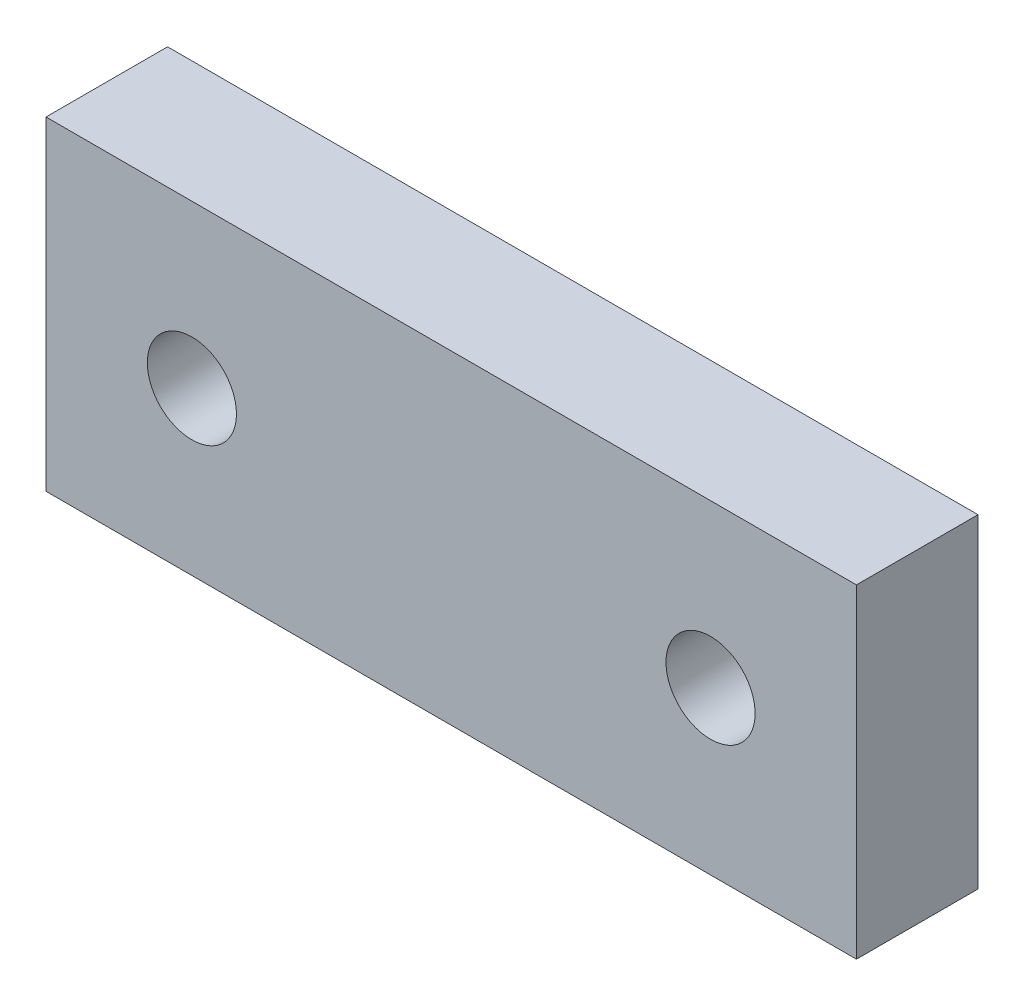
ISO-10303-21;
HEADER;
FILE_DESCRIPTION(('STEP AP214'),'2;1');
FILE_NAME('part.step','',(''),(''),'','','');
FILE_SCHEMA(('AUTOMOTIVE_DESIGN { 1 0 10303 214 1 1 1 1 }'));
ENDSEC;
DATA;
#1=APPLICATION_CONTEXT('core data for automotive mechanical design processes');
#2=APPLICATION_PROTOCOL_DEFINITION('international standard','automotive_design',2000,#1);
#3=PRODUCT_CONTEXT('',#1,'mechanical');
#4=PRODUCT('Part','Part','',(#3));
#5=PRODUCT_RELATED_PRODUCT_CATEGORY('part','',(#4));
#6=PRODUCT_DEFINITION_FORMATION('','',#4);
#7=PRODUCT_DEFINITION_CONTEXT('part definition',#1,'design');
#8=PRODUCT_DEFINITION('design','',#6,#7);
#9=PRODUCT_DEFINITION_SHAPE('','',#8);
#10=(LENGTH_UNIT() NAMED_UNIT(*) SI_UNIT(.MILLI.,.METRE.));
#11=(NAMED_UNIT(*) PLANE_ANGLE_UNIT() SI_UNIT($,.RADIAN.));
#12=(NAMED_UNIT(*) SI_UNIT($,.STERADIAN.) SOLID_ANGLE_UNIT());
#13=UNCERTAINTY_MEASURE_WITH_UNIT(LENGTH_MEASURE(1.E-05),#10,'distance_accuracy_value','');
#14=(GEOMETRIC_REPRESENTATION_CONTEXT(3) GLOBAL_UNCERTAINTY_ASSIGNED_CONTEXT((#13)) GLOBAL_UNIT_ASSIGNED_CONTEXT((#10,
#11,#12)) REPRESENTATION_CONTEXT('',''));
#15=CARTESIAN_POINT('',(0.,0.,0.));
#16=DIRECTION('',(0.,0.,1.));
#17=DIRECTION('',(1.,0.,0.));
#18=AXIS2_PLACEMENT_3D('',#15,#16,#17);
#19=CARTESIAN_POINT('',(0.,0.,7.5));
#20=DIRECTION('',(0.,0.,-1.));
#21=DIRECTION('',(-1.,0.,0.));
#22=AXIS2_PLACEMENT_3D('',#19,#20,#21);
#23=PLANE('',#22);
#24=DIRECTION('',(0.,1.,0.));
#25=VECTOR('',#24,1.);
#26=CARTESIAN_POINT('',(25.,-10.,7.5));
#27=LINE('',#26,#25);
#28=CARTESIAN_POINT('',(25.,-10.,7.5));
#29=VERTEX_POINT('',#28);
#30=CARTESIAN_POINT('',(25.,9.99999999999999,7.5));
#31=VERTEX_POINT('',#30);
#32=EDGE_CURVE('E98',#29,#31,#27,.T.);
#33=ORIENTED_EDGE('',*,*,#32,.T.);
#34=DIRECTION('',(-1.,0.,0.));
#35=VECTOR('',#34,1.);
#36=CARTESIAN_POINT('',(-25.,9.99999999999999,7.5));
#37=LINE('',#36,#35);
#38=CARTESIAN_POINT('',(-25.,9.99999999999999,7.5));
#39=VERTEX_POINT('',#38);
#40=EDGE_CURVE('E93',#31,#39,#37,.T.);
#41=ORIENTED_EDGE('',*,*,#40,.T.);
#42=DIRECTION('',(0.,-1.,0.));
#43=VECTOR('',#42,1.);
#44=CARTESIAN_POINT('',(-25.,-10.,7.5));
#45=LINE('',#44,#43);
#46=CARTESIAN_POINT('',(-25.,-10.,7.5));
#47=VERTEX_POINT('',#46);
#48=EDGE_CURVE('E96',#39,#47,#45,.T.);
#49=ORIENTED_EDGE('',*,*,#48,.T.);
#50=DIRECTION('',(1.,0.,0.));
#51=VECTOR('',#50,1.);
#52=CARTESIAN_POINT('',(-25.,-10.,7.5));
#53=LINE('',#52,#51);
#54=EDGE_CURVE('E63',#47,#29,#53,.T.);
#55=ORIENTED_EDGE('',*,*,#54,.T.);
#56=EDGE_LOOP('',(#33,#41,#49,#55));
#57=FACE_BOUND('',#56,.T.);
#58=CARTESIAN_POINT('',(-16.,0.,7.5));
#59=DIRECTION('',(0.,0.,1.));
#60=DIRECTION('',(1.,0.,0.));
#61=AXIS2_PLACEMENT_3D('',#58,#59,#60);
#62=CIRCLE('',#61,2.75);
#63=CARTESIAN_POINT('',(-13.25,0.,7.5));
#64=VERTEX_POINT('',#63);
#65=EDGE_CURVE('E118',#64,#64,#62,.T.);
#66=ORIENTED_EDGE('',*,*,#65,.F.);
#67=EDGE_LOOP('',(#66));
#68=FACE_BOUND('',#67,.T.);
#69=CARTESIAN_POINT('',(16.,0.,7.5));
#70=DIRECTION('',(0.,0.,1.));
#71=DIRECTION('',(-1.,0.,0.));
#72=AXIS2_PLACEMENT_3D('',#69,#70,#71);
#73=CIRCLE('',#72,2.75);
#74=CARTESIAN_POINT('',(13.25,0.,7.5));
#75=VERTEX_POINT('',#74);
#76=EDGE_CURVE('E140',#75,#75,#73,.T.);
#77=ORIENTED_EDGE('',*,*,#76,.F.);
#78=EDGE_LOOP('',(#77));
#79=FACE_BOUND('',#78,.T.);
#80=ADVANCED_FACE('F45',(#57,#68,#79),#23,.F.);
#81=CARTESIAN_POINT('',(0.,0.,0.));
#82=DIRECTION('',(0.,0.,-1.));
#83=DIRECTION('',(-1.,0.,0.));
#84=AXIS2_PLACEMENT_3D('',#81,#82,#83);
#85=PLANE('',#84);
#86=CARTESIAN_POINT('',(-16.,0.,0.));
#87=DIRECTION('',(0.,0.,1.));
#88=DIRECTION('',(1.,0.,0.));
#89=AXIS2_PLACEMENT_3D('',#86,#87,#88);
#90=CIRCLE('',#89,2.75);
#91=CARTESIAN_POINT('',(-13.25,0.,0.));
#92=VERTEX_POINT('',#91);
#93=EDGE_CURVE('E136',#92,#92,#90,.T.);
#94=ORIENTED_EDGE('',*,*,#93,.T.);
#95=EDGE_LOOP('',(#94));
#96=FACE_BOUND('',#95,.T.);
#97=DIRECTION('',(0.,1.,0.));
#98=VECTOR('',#97,1.);
#99=CARTESIAN_POINT('',(25.,-10.,0.));
#100=LINE('',#99,#98);
#101=CARTESIAN_POINT('',(25.,-10.,0.));
#102=VERTEX_POINT('',#101);
#103=CARTESIAN_POINT('',(25.,9.99999999999999,0.));
#104=VERTEX_POINT('',#103);
#105=EDGE_CURVE('E114',#102,#104,#100,.T.);
#106=ORIENTED_EDGE('',*,*,#105,.F.);
#107=DIRECTION('',(1.,0.,0.));
#108=VECTOR('',#107,1.);
#109=CARTESIAN_POINT('',(-25.,-10.,0.));
#110=LINE('',#109,#108);
#111=CARTESIAN_POINT('',(-25.,-10.,0.));
#112=VERTEX_POINT('',#111);
#113=EDGE_CURVE('E86',#112,#102,#110,.T.);
#114=ORIENTED_EDGE('',*,*,#113,.F.);
#115=DIRECTION('',(0.,-1.,0.));
#116=VECTOR('',#115,1.);
#117=CARTESIAN_POINT('',(-25.,-10.,0.));
#118=LINE('',#117,#116);
#119=CARTESIAN_POINT('',(-25.,9.99999999999999,0.));
#120=VERTEX_POINT('',#119);
#121=EDGE_CURVE('E80',#120,#112,#118,.T.);
#122=ORIENTED_EDGE('',*,*,#121,.F.);
#123=DIRECTION('',(-1.,0.,0.));
#124=VECTOR('',#123,1.);
#125=CARTESIAN_POINT('',(-25.,9.99999999999999,0.));
#126=LINE('',#125,#124);
#127=EDGE_CURVE('E103',#104,#120,#126,.T.);
#128=ORIENTED_EDGE('',*,*,#127,.F.);
#129=EDGE_LOOP('',(#106,#114,#122,#128));
#130=FACE_BOUND('',#129,.T.);
#131=CARTESIAN_POINT('',(16.,0.,0.));
#132=DIRECTION('',(0.,0.,1.));
#133=DIRECTION('',(-1.,0.,0.));
#134=AXIS2_PLACEMENT_3D('',#131,#132,#133);
#135=CIRCLE('',#134,2.75);
#136=CARTESIAN_POINT('',(13.25,0.,0.));
#137=VERTEX_POINT('',#136);
#138=EDGE_CURVE('E144',#137,#137,#135,.T.);
#139=ORIENTED_EDGE('',*,*,#138,.T.);
#140=EDGE_LOOP('',(#139));
#141=FACE_BOUND('',#140,.T.);
#142=ADVANCED_FACE('F131',(#96,#130,#141),#85,.T.);
#143=CARTESIAN_POINT('',(25.,-10.,7.5));
#144=DIRECTION('',(-1.,0.,0.));
#145=DIRECTION('',(0.,-1.,0.));
#146=AXIS2_PLACEMENT_3D('',#143,#144,#145);
#147=PLANE('',#146);
#148=ORIENTED_EDGE('',*,*,#105,.T.);
#149=DIRECTION('',(0.,0.,-1.));
#150=VECTOR('',#149,1.);
#151=CARTESIAN_POINT('',(25.,9.99999999999999,7.5));
#152=LINE('',#151,#150);
#153=EDGE_CURVE('E11',#31,#104,#152,.T.);
#154=ORIENTED_EDGE('',*,*,#153,.F.);
#155=ORIENTED_EDGE('',*,*,#32,.F.);
#156=DIRECTION('',(0.,0.,-1.));
#157=VECTOR('',#156,1.);
#158=CARTESIAN_POINT('',(25.,-10.,7.5));
#159=LINE('',#158,#157);
#160=EDGE_CURVE('E110',#29,#102,#159,.T.);
#161=ORIENTED_EDGE('',*,*,#160,.T.);
#162=EDGE_LOOP('',(#148,#154,#155,#161));
#163=FACE_BOUND('',#162,.T.);
#164=ADVANCED_FACE('F47',(#163),#147,.F.);
#165=CARTESIAN_POINT('',(-25.,9.99999999999999,7.5));
#166=DIRECTION('',(0.,-1.,0.));
#167=DIRECTION('',(0.,0.,-1.));
#168=AXIS2_PLACEMENT_3D('',#165,#166,#167);
#169=PLANE('',#168);
#170=ORIENTED_EDGE('',*,*,#127,.T.);
#171=DIRECTION('',(0.,0.,-1.));
#172=VECTOR('',#171,1.);
#173=CARTESIAN_POINT('',(-25.,9.99999999999999,7.5));
#174=LINE('',#173,#172);
#175=EDGE_CURVE('E55',#39,#120,#174,.T.);
#176=ORIENTED_EDGE('',*,*,#175,.F.);
#177=ORIENTED_EDGE('',*,*,#40,.F.);
#178=ORIENTED_EDGE('',*,*,#153,.T.);
#179=EDGE_LOOP('',(#170,#176,#177,#178));
#180=FACE_BOUND('',#179,.T.);
#181=ADVANCED_FACE('F102',(#180),#169,.F.);
#182=CARTESIAN_POINT('',(-25.,-10.,7.5));
#183=DIRECTION('',(1.,0.,0.));
#184=DIRECTION('',(0.,0.,-1.));
#185=AXIS2_PLACEMENT_3D('',#182,#183,#184);
#186=PLANE('',#185);
#187=ORIENTED_EDGE('',*,*,#121,.T.);
#188=DIRECTION('',(0.,0.,-1.));
#189=VECTOR('',#188,1.);
#190=CARTESIAN_POINT('',(-25.,-10.,7.5));
#191=LINE('',#190,#189);
#192=EDGE_CURVE('E105',#47,#112,#191,.T.);
#193=ORIENTED_EDGE('',*,*,#192,.F.);
#194=ORIENTED_EDGE('',*,*,#48,.F.);
#195=ORIENTED_EDGE('',*,*,#175,.T.);
#196=EDGE_LOOP('',(#187,#193,#194,#195));
#197=FACE_BOUND('',#196,.T.);
#198=ADVANCED_FACE('F106',(#197),#186,.F.);
#199=CARTESIAN_POINT('',(-25.,-10.,7.5));
#200=DIRECTION('',(0.,1.,0.));
#201=DIRECTION('',(-1.,0.,0.));
#202=AXIS2_PLACEMENT_3D('',#199,#200,#201);
#203=PLANE('',#202);
#204=ORIENTED_EDGE('',*,*,#113,.T.);
#205=ORIENTED_EDGE('',*,*,#160,.F.);
#206=ORIENTED_EDGE('',*,*,#54,.F.);
#207=ORIENTED_EDGE('',*,*,#192,.T.);
#208=EDGE_LOOP('',(#204,#205,#206,#207));
#209=FACE_BOUND('',#208,.T.);
#210=ADVANCED_FACE('F128',(#209),#203,.F.);
#211=CARTESIAN_POINT('',(-16.,0.,7.5));
#212=DIRECTION('',(0.,0.,-1.));
#213=DIRECTION('',(-1.,0.,0.));
#214=AXIS2_PLACEMENT_3D('',#211,#212,#213);
#215=CYLINDRICAL_SURFACE('',#214,2.75);
#216=ORIENTED_EDGE('',*,*,#65,.T.);
#217=EDGE_LOOP('',(#216));
#218=FACE_BOUND('',#217,.T.);
#219=ORIENTED_EDGE('',*,*,#93,.F.);
#220=EDGE_LOOP('',(#219));
#221=FACE_BOUND('',#220,.T.);
#222=ADVANCED_FACE('F163',(#218,#221),#215,.F.);
#223=CARTESIAN_POINT('',(16.,0.,7.5));
#224=DIRECTION('',(0.,0.,-1.));
#225=DIRECTION('',(-1.,0.,0.));
#226=AXIS2_PLACEMENT_3D('',#223,#224,#225);
#227=CYLINDRICAL_SURFACE('',#226,2.75);
#228=ORIENTED_EDGE('',*,*,#76,.T.);
#229=EDGE_LOOP('',(#228));
#230=FACE_BOUND('',#229,.T.);
#231=ORIENTED_EDGE('',*,*,#138,.F.);
#232=EDGE_LOOP('',(#231));
#233=FACE_BOUND('',#232,.T.);
#234=ADVANCED_FACE('F152',(#230,#233),#227,.F.);
#235=CLOSED_SHELL('',(#80,#142,#164,#181,#198,#210,#222,#234));
#236=MANIFOLD_SOLID_BREP('B2',#235);
#237=ADVANCED_BREP_SHAPE_REPRESENTATION('',(#18,#236),#14);
#238=SHAPE_DEFINITION_REPRESENTATION(#9,#237);
ENDSEC;
END-ISO-10303-21;
